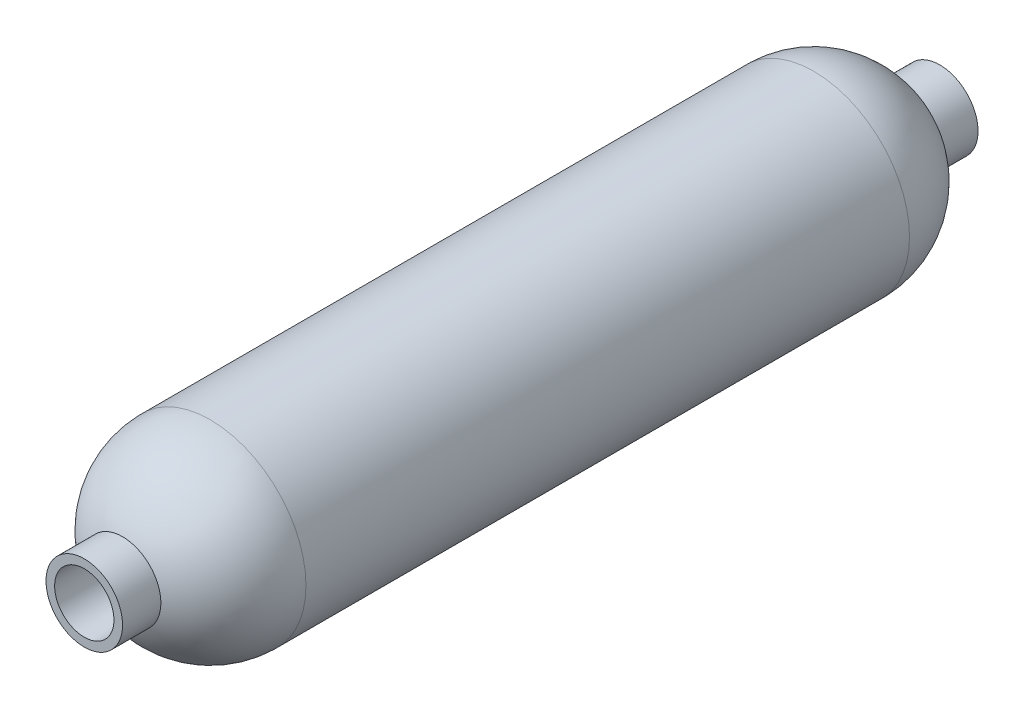
ISO-10303-21;
HEADER;
FILE_DESCRIPTION(('STEP AP214'),'2;1');
FILE_NAME('part.step','',(''),(''),'','','');
FILE_SCHEMA(('AUTOMOTIVE_DESIGN { 1 0 10303 214 1 1 1 1 }'));
ENDSEC;
DATA;
#1=APPLICATION_CONTEXT('core data for automotive mechanical design processes');
#2=APPLICATION_PROTOCOL_DEFINITION('international standard','automotive_design',2000,#1);
#3=PRODUCT_CONTEXT('',#1,'mechanical');
#4=PRODUCT('Part','Part','',(#3));
#5=PRODUCT_RELATED_PRODUCT_CATEGORY('part','',(#4));
#6=PRODUCT_DEFINITION_FORMATION('','',#4);
#7=PRODUCT_DEFINITION_CONTEXT('part definition',#1,'design');
#8=PRODUCT_DEFINITION('design','',#6,#7);
#9=PRODUCT_DEFINITION_SHAPE('','',#8);
#10=(LENGTH_UNIT() NAMED_UNIT(*) SI_UNIT(.MILLI.,.METRE.));
#11=(NAMED_UNIT(*) PLANE_ANGLE_UNIT() SI_UNIT($,.RADIAN.));
#12=(NAMED_UNIT(*) SI_UNIT($,.STERADIAN.) SOLID_ANGLE_UNIT());
#13=UNCERTAINTY_MEASURE_WITH_UNIT(LENGTH_MEASURE(1.E-05),#10,'distance_accuracy_value','');
#14=(GEOMETRIC_REPRESENTATION_CONTEXT(3) GLOBAL_UNCERTAINTY_ASSIGNED_CONTEXT((#13)) GLOBAL_UNIT_ASSIGNED_CONTEXT((#10,
#11,#12)) REPRESENTATION_CONTEXT('',''));
#15=CARTESIAN_POINT('',(0.,0.,0.));
#16=DIRECTION('',(0.,0.,1.));
#17=DIRECTION('',(1.,0.,0.));
#18=AXIS2_PLACEMENT_3D('',#15,#16,#17);
#19=CARTESIAN_POINT('',(0.,0.,113.538));
#20=DIRECTION('',(0.,0.,1.));
#21=DIRECTION('',(1.,0.,0.));
#22=AXIS2_PLACEMENT_3D('',#19,#20,#21);
#23=PLANE('',#22);
#24=CARTESIAN_POINT('',(0.,0.,113.538));
#25=DIRECTION('',(0.,0.,1.));
#26=DIRECTION('',(1.,0.,0.));
#27=AXIS2_PLACEMENT_3D('',#24,#25,#26);
#28=CIRCLE('',#27,7.874);
#29=CARTESIAN_POINT('',(7.874,0.,113.538));
#30=VERTEX_POINT('',#29);
#31=EDGE_CURVE('E69',#30,#30,#28,.F.);
#32=ORIENTED_EDGE('',*,*,#31,.T.);
#33=EDGE_LOOP('',(#32));
#34=FACE_BOUND('',#33,.T.);
#35=CARTESIAN_POINT('',(0.,0.,113.538));
#36=DIRECTION('',(0.,0.,-1.));
#37=DIRECTION('',(-1.,0.,0.));
#38=AXIS2_PLACEMENT_3D('',#35,#36,#37);
#39=CIRCLE('',#38,10.16);
#40=CARTESIAN_POINT('',(-10.16,0.,113.538));
#41=VERTEX_POINT('',#40);
#42=EDGE_CURVE('E64',#41,#41,#39,.T.);
#43=ORIENTED_EDGE('',*,*,#42,.F.);
#44=EDGE_LOOP('',(#43));
#45=FACE_BOUND('',#44,.T.);
#46=ADVANCED_FACE('F37',(#34,#45),#23,.T.);
#47=CARTESIAN_POINT('',(0.,0.,-113.538));
#48=DIRECTION('',(0.,0.,-1.));
#49=DIRECTION('',(-1.,0.,0.));
#50=AXIS2_PLACEMENT_3D('',#47,#48,#49);
#51=PLANE('',#50);
#52=CARTESIAN_POINT('',(0.,0.,-113.538));
#53=DIRECTION('',(0.,0.,-1.));
#54=DIRECTION('',(-1.,0.,0.));
#55=AXIS2_PLACEMENT_3D('',#52,#53,#54);
#56=CIRCLE('',#55,7.874);
#57=CARTESIAN_POINT('',(-7.874,0.,-113.538));
#58=VERTEX_POINT('',#57);
#59=EDGE_CURVE('E68',#58,#58,#56,.T.);
#60=ORIENTED_EDGE('',*,*,#59,.F.);
#61=EDGE_LOOP('',(#60));
#62=FACE_BOUND('',#61,.T.);
#63=CARTESIAN_POINT('',(0.,0.,-113.538));
#64=DIRECTION('',(0.,0.,-1.));
#65=DIRECTION('',(-1.,0.,0.));
#66=AXIS2_PLACEMENT_3D('',#63,#64,#65);
#67=CIRCLE('',#66,10.16);
#68=CARTESIAN_POINT('',(-10.16,0.,-113.538));
#69=VERTEX_POINT('',#68);
#70=EDGE_CURVE('E10',#69,#69,#67,.T.);
#71=ORIENTED_EDGE('',*,*,#70,.T.);
#72=EDGE_LOOP('',(#71));
#73=FACE_BOUND('',#72,.T.);
#74=ADVANCED_FACE('F102',(#62,#73),#51,.T.);
#75=CARTESIAN_POINT('',(0.,0.,-113.538));
#76=DIRECTION('',(0.,0.,-1.));
#77=DIRECTION('',(-1.,0.,0.));
#78=AXIS2_PLACEMENT_3D('',#75,#76,#77);
#79=CYLINDRICAL_SURFACE('',#78,10.16);
#80=CARTESIAN_POINT('',(0.,0.,-103.378));
#81=DIRECTION('',(0.,0.,-1.));
#82=DIRECTION('',(-1.,0.,0.));
#83=AXIS2_PLACEMENT_3D('',#80,#81,#82);
#84=CIRCLE('',#83,10.16);
#85=CARTESIAN_POINT('',(-10.16,0.,-103.378));
#86=VERTEX_POINT('',#85);
#87=EDGE_CURVE('E44',#86,#86,#84,.T.);
#88=ORIENTED_EDGE('',*,*,#87,.T.);
#89=EDGE_LOOP('',(#88));
#90=FACE_BOUND('',#89,.T.);
#91=ORIENTED_EDGE('',*,*,#70,.F.);
#92=EDGE_LOOP('',(#91));
#93=FACE_BOUND('',#92,.T.);
#94=ADVANCED_FACE('F104',(#90,#93),#79,.T.);
#95=CARTESIAN_POINT('',(0.,0.,-80.0985154696243));
#96=DIRECTION('',(0.,0.,-1.));
#97=DIRECTION('',(0.,1.,0.));
#98=AXIS2_PLACEMENT_3D('',#95,#96,#97);
#99=SPHERICAL_SURFACE('',#98,25.4);
#100=CARTESIAN_POINT('',(0.,0.,-80.0985154696243));
#101=DIRECTION('',(0.,0.,-1.));
#102=DIRECTION('',(-1.,0.,0.));
#103=AXIS2_PLACEMENT_3D('',#100,#101,#102);
#104=CIRCLE('',#103,25.4);
#105=CARTESIAN_POINT('',(-25.4,0.,-80.0985154696243));
#106=VERTEX_POINT('',#105);
#107=EDGE_CURVE('E49',#106,#106,#104,.T.);
#108=ORIENTED_EDGE('',*,*,#107,.T.);
#109=EDGE_LOOP('',(#108));
#110=FACE_BOUND('',#109,.T.);
#111=ORIENTED_EDGE('',*,*,#87,.F.);
#112=EDGE_LOOP('',(#111));
#113=FACE_BOUND('',#112,.T.);
#114=ADVANCED_FACE('F109',(#110,#113),#99,.T.);
#115=CARTESIAN_POINT('',(0.,0.,-113.538));
#116=DIRECTION('',(0.,0.,-1.));
#117=DIRECTION('',(-1.,0.,0.));
#118=AXIS2_PLACEMENT_3D('',#115,#116,#117);
#119=CYLINDRICAL_SURFACE('',#118,25.4);
#120=CARTESIAN_POINT('',(0.,0.,80.0985154696243));
#121=DIRECTION('',(0.,0.,-1.));
#122=DIRECTION('',(-1.,0.,0.));
#123=AXIS2_PLACEMENT_3D('',#120,#121,#122);
#124=CIRCLE('',#123,25.4);
#125=CARTESIAN_POINT('',(-25.4,0.,80.0985154696243));
#126=VERTEX_POINT('',#125);
#127=EDGE_CURVE('E54',#126,#126,#124,.T.);
#128=ORIENTED_EDGE('',*,*,#127,.T.);
#129=EDGE_LOOP('',(#128));
#130=FACE_BOUND('',#129,.T.);
#131=ORIENTED_EDGE('',*,*,#107,.F.);
#132=EDGE_LOOP('',(#131));
#133=FACE_BOUND('',#132,.T.);
#134=ADVANCED_FACE('F115',(#130,#133),#119,.T.);
#135=CARTESIAN_POINT('',(0.,0.,80.0985154696243));
#136=DIRECTION('',(0.,0.,-1.));
#137=DIRECTION('',(0.,1.,0.));
#138=AXIS2_PLACEMENT_3D('',#135,#136,#137);
#139=SPHERICAL_SURFACE('',#138,25.4);
#140=CARTESIAN_POINT('',(0.,0.,103.378));
#141=DIRECTION('',(0.,0.,-1.));
#142=DIRECTION('',(-1.,0.,0.));
#143=AXIS2_PLACEMENT_3D('',#140,#141,#142);
#144=CIRCLE('',#143,10.16);
#145=CARTESIAN_POINT('',(-10.16,0.,103.378));
#146=VERTEX_POINT('',#145);
#147=EDGE_CURVE('E60',#146,#146,#144,.T.);
#148=ORIENTED_EDGE('',*,*,#147,.T.);
#149=EDGE_LOOP('',(#148));
#150=FACE_BOUND('',#149,.T.);
#151=ORIENTED_EDGE('',*,*,#127,.F.);
#152=EDGE_LOOP('',(#151));
#153=FACE_BOUND('',#152,.T.);
#154=ADVANCED_FACE('F119',(#150,#153),#139,.T.);
#155=CARTESIAN_POINT('',(0.,0.,-113.538));
#156=DIRECTION('',(0.,0.,-1.));
#157=DIRECTION('',(-1.,0.,0.));
#158=AXIS2_PLACEMENT_3D('',#155,#156,#157);
#159=CYLINDRICAL_SURFACE('',#158,10.16);
#160=ORIENTED_EDGE('',*,*,#42,.T.);
#161=EDGE_LOOP('',(#160));
#162=FACE_BOUND('',#161,.T.);
#163=ORIENTED_EDGE('',*,*,#147,.F.);
#164=EDGE_LOOP('',(#163));
#165=FACE_BOUND('',#164,.T.);
#166=ADVANCED_FACE('F98',(#162,#165),#159,.T.);
#167=CARTESIAN_POINT('',(0.,0.,-113.538));
#168=DIRECTION('',(0.,0.,-1.));
#169=DIRECTION('',(-1.,0.,0.));
#170=AXIS2_PLACEMENT_3D('',#167,#168,#169);
#171=CYLINDRICAL_SURFACE('',#170,7.874);
#172=CARTESIAN_POINT('',(0.,0.,-101.829993100011));
#173=DIRECTION('',(0.,0.,1.));
#174=DIRECTION('',(1.,0.,0.));
#175=AXIS2_PLACEMENT_3D('',#172,#173,#174);
#176=CIRCLE('',#175,7.874);
#177=CARTESIAN_POINT('',(7.874,0.,-101.829993100011));
#178=VERTEX_POINT('',#177);
#179=EDGE_CURVE('E77',#178,#178,#176,.F.);
#180=ORIENTED_EDGE('',*,*,#179,.F.);
#181=EDGE_LOOP('',(#180));
#182=FACE_BOUND('',#181,.T.);
#183=ORIENTED_EDGE('',*,*,#59,.T.);
#184=EDGE_LOOP('',(#183));
#185=FACE_BOUND('',#184,.T.);
#186=ADVANCED_FACE('F95',(#182,#185),#171,.F.);
#187=CARTESIAN_POINT('',(0.,0.,-80.0985154696243));
#188=DIRECTION('',(0.,0.,-1.));
#189=DIRECTION('',(0.,1.,0.));
#190=AXIS2_PLACEMENT_3D('',#187,#188,#189);
#191=SPHERICAL_SURFACE('',#190,23.114);
#192=CARTESIAN_POINT('',(0.,0.,-80.0985154696243));
#193=DIRECTION('',(0.,0.,-1.));
#194=DIRECTION('',(-1.,0.,0.));
#195=AXIS2_PLACEMENT_3D('',#192,#193,#194);
#196=CIRCLE('',#195,23.114);
#197=CARTESIAN_POINT('',(-23.114,0.,-80.0985154696243));
#198=VERTEX_POINT('',#197);
#199=EDGE_CURVE('E85',#198,#198,#196,.T.);
#200=ORIENTED_EDGE('',*,*,#199,.F.);
#201=EDGE_LOOP('',(#200));
#202=FACE_BOUND('',#201,.T.);
#203=ORIENTED_EDGE('',*,*,#179,.T.);
#204=EDGE_LOOP('',(#203));
#205=FACE_BOUND('',#204,.T.);
#206=ADVANCED_FACE('F93',(#202,#205),#191,.F.);
#207=CARTESIAN_POINT('',(0.,0.,-113.538));
#208=DIRECTION('',(0.,0.,-1.));
#209=DIRECTION('',(-1.,0.,0.));
#210=AXIS2_PLACEMENT_3D('',#207,#208,#209);
#211=CYLINDRICAL_SURFACE('',#210,23.114);
#212=CARTESIAN_POINT('',(0.,0.,80.0985154696243));
#213=DIRECTION('',(0.,0.,-1.));
#214=DIRECTION('',(-1.,0.,0.));
#215=AXIS2_PLACEMENT_3D('',#212,#213,#214);
#216=CIRCLE('',#215,23.114);
#217=CARTESIAN_POINT('',(-23.114,0.,80.0985154696243));
#218=VERTEX_POINT('',#217);
#219=EDGE_CURVE('E81',#218,#218,#216,.T.);
#220=ORIENTED_EDGE('',*,*,#219,.F.);
#221=EDGE_LOOP('',(#220));
#222=FACE_BOUND('',#221,.T.);
#223=ORIENTED_EDGE('',*,*,#199,.T.);
#224=EDGE_LOOP('',(#223));
#225=FACE_BOUND('',#224,.T.);
#226=ADVANCED_FACE('F134',(#222,#225),#211,.F.);
#227=CARTESIAN_POINT('',(0.,0.,80.0985154696243));
#228=DIRECTION('',(0.,0.,-1.));
#229=DIRECTION('',(0.,1.,0.));
#230=AXIS2_PLACEMENT_3D('',#227,#228,#229);
#231=SPHERICAL_SURFACE('',#230,23.114);
#232=CARTESIAN_POINT('',(0.,0.,101.829993100011));
#233=DIRECTION('',(0.,0.,-1.));
#234=DIRECTION('',(-1.,0.,0.));
#235=AXIS2_PLACEMENT_3D('',#232,#233,#234);
#236=CIRCLE('',#235,7.874);
#237=CARTESIAN_POINT('',(-7.874,0.,101.829993100011));
#238=VERTEX_POINT('',#237);
#239=EDGE_CURVE('E73',#238,#238,#236,.T.);
#240=ORIENTED_EDGE('',*,*,#239,.F.);
#241=EDGE_LOOP('',(#240));
#242=FACE_BOUND('',#241,.T.);
#243=ORIENTED_EDGE('',*,*,#219,.T.);
#244=EDGE_LOOP('',(#243));
#245=FACE_BOUND('',#244,.T.);
#246=ADVANCED_FACE('F130',(#242,#245),#231,.F.);
#247=CARTESIAN_POINT('',(0.,0.,-113.538));
#248=DIRECTION('',(0.,0.,-1.));
#249=DIRECTION('',(-1.,0.,0.));
#250=AXIS2_PLACEMENT_3D('',#247,#248,#249);
#251=CYLINDRICAL_SURFACE('',#250,7.874);
#252=ORIENTED_EDGE('',*,*,#31,.F.);
#253=EDGE_LOOP('',(#252));
#254=FACE_BOUND('',#253,.T.);
#255=ORIENTED_EDGE('',*,*,#239,.T.);
#256=EDGE_LOOP('',(#255));
#257=FACE_BOUND('',#256,.T.);
#258=ADVANCED_FACE('F127',(#254,#257),#251,.F.);
#259=CLOSED_SHELL('',(#46,#74,#94,#114,#134,#154,#166,#186,#206,#226,#246,#258));
#260=MANIFOLD_SOLID_BREP('B2',#259);
#261=ADVANCED_BREP_SHAPE_REPRESENTATION('',(#18,#260),#14);
#262=SHAPE_DEFINITION_REPRESENTATION(#9,#261);
ENDSEC;
END-ISO-10303-21;
